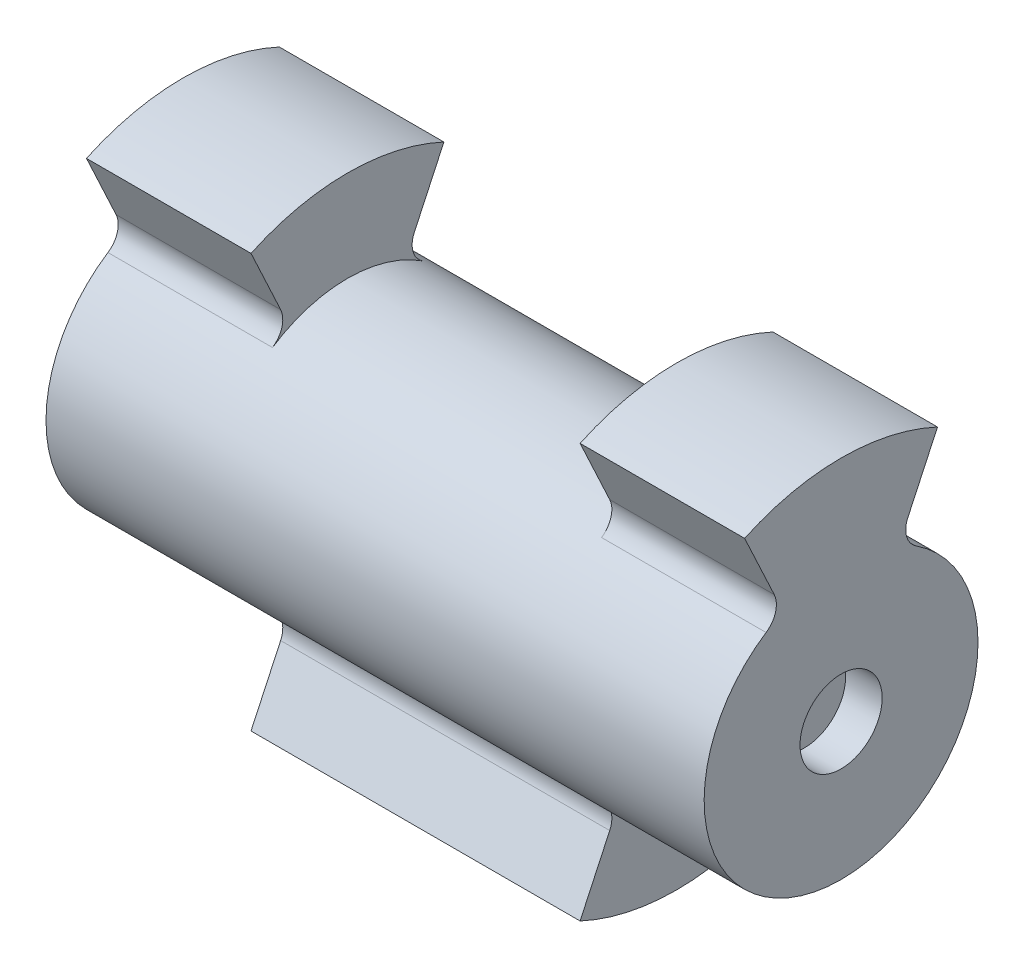
ISO-10303-21;
HEADER;
FILE_DESCRIPTION(('STEP AP214'),'2;1');
FILE_NAME('part.step','',(''),(''),'','','');
FILE_SCHEMA(('AUTOMOTIVE_DESIGN { 1 0 10303 214 1 1 1 1 }'));
ENDSEC;
DATA;
#1=APPLICATION_CONTEXT('core data for automotive mechanical design processes');
#2=APPLICATION_PROTOCOL_DEFINITION('international standard','automotive_design',2000,#1);
#3=PRODUCT_CONTEXT('',#1,'mechanical');
#4=PRODUCT('Part','Part','',(#3));
#5=PRODUCT_RELATED_PRODUCT_CATEGORY('part','',(#4));
#6=PRODUCT_DEFINITION_FORMATION('','',#4);
#7=PRODUCT_DEFINITION_CONTEXT('part definition',#1,'design');
#8=PRODUCT_DEFINITION('design','',#6,#7);
#9=PRODUCT_DEFINITION_SHAPE('','',#8);
#10=(LENGTH_UNIT() NAMED_UNIT(*) SI_UNIT(.MILLI.,.METRE.));
#11=(NAMED_UNIT(*) PLANE_ANGLE_UNIT() SI_UNIT($,.RADIAN.));
#12=(NAMED_UNIT(*) SI_UNIT($,.STERADIAN.) SOLID_ANGLE_UNIT());
#13=UNCERTAINTY_MEASURE_WITH_UNIT(LENGTH_MEASURE(1.E-05),#10,'distance_accuracy_value','');
#14=(GEOMETRIC_REPRESENTATION_CONTEXT(3) GLOBAL_UNCERTAINTY_ASSIGNED_CONTEXT((#13)) GLOBAL_UNIT_ASSIGNED_CONTEXT((#10,
#11,#12)) REPRESENTATION_CONTEXT('',''));
#15=CARTESIAN_POINT('',(0.,0.,0.));
#16=DIRECTION('',(0.,0.,1.));
#17=DIRECTION('',(1.,0.,0.));
#18=AXIS2_PLACEMENT_3D('',#15,#16,#17);
#19=CARTESIAN_POINT('',(-72.1,0.,0.));
#20=DIRECTION('',(1.,0.,0.));
#21=DIRECTION('',(0.,0.,-1.));
#22=AXIS2_PLACEMENT_3D('',#19,#20,#21);
#23=CYLINDRICAL_SURFACE('',#22,30.);
#24=CARTESIAN_POINT('',(-72.1,0.,0.));
#25=DIRECTION('',(1.,0.,0.));
#26=DIRECTION('',(0.,0.,-1.));
#27=AXIS2_PLACEMENT_3D('',#24,#25,#26);
#28=CIRCLE('',#27,30.);
#29=CARTESIAN_POINT('',(-72.1,25.0991411829877,16.43268425658));
#30=VERTEX_POINT('',#29);
#31=CARTESIAN_POINT('',(-72.1,25.0991411829877,-16.43268425658));
#32=VERTEX_POINT('',#31);
#33=EDGE_CURVE('E278',#30,#32,#28,.T.);
#34=ORIENTED_EDGE('',*,*,#33,.T.);
#35=DIRECTION('',(1.,0.,0.));
#36=VECTOR('',#35,1.);
#37=CARTESIAN_POINT('',(-72.1,25.0991411829877,-16.43268425658));
#38=LINE('',#37,#36);
#39=CARTESIAN_POINT('',(-36.05,25.0991411829877,-16.43268425658));
#40=VERTEX_POINT('',#39);
#41=EDGE_CURVE('E310',#32,#40,#38,.T.);
#42=ORIENTED_EDGE('',*,*,#41,.T.);
#43=CARTESIAN_POINT('',(-36.05,0.,0.));
#44=DIRECTION('',(1.,0.,0.));
#45=DIRECTION('',(0.,0.,-1.));
#46=AXIS2_PLACEMENT_3D('',#43,#44,#45);
#47=CIRCLE('',#46,30.);
#48=CARTESIAN_POINT('',(-36.05,25.0991411829877,16.43268425658));
#49=VERTEX_POINT('',#48);
#50=EDGE_CURVE('E240',#49,#40,#47,.F.);
#51=ORIENTED_EDGE('',*,*,#50,.F.);
#52=DIRECTION('',(1.,0.,0.));
#53=VECTOR('',#52,1.);
#54=CARTESIAN_POINT('',(-72.1,25.0991411829877,16.43268425658));
#55=LINE('',#54,#53);
#56=EDGE_CURVE('E306',#49,#30,#55,.F.);
#57=ORIENTED_EDGE('',*,*,#56,.T.);
#58=EDGE_LOOP('',(#34,#42,#51,#57));
#59=FACE_BOUND('',#58,.T.);
#60=CARTESIAN_POINT('',(36.05,0.,0.));
#61=DIRECTION('',(1.,0.,0.));
#62=DIRECTION('',(0.,0.,-1.));
#63=AXIS2_PLACEMENT_3D('',#60,#61,#62);
#64=CIRCLE('',#63,30.);
#65=CARTESIAN_POINT('',(36.05,25.0991411829877,16.43268425658));
#66=VERTEX_POINT('',#65);
#67=CARTESIAN_POINT('',(36.05,25.0991411829877,-16.43268425658));
#68=VERTEX_POINT('',#67);
#69=EDGE_CURVE('E282',#66,#68,#64,.F.);
#70=ORIENTED_EDGE('',*,*,#69,.T.);
#71=DIRECTION('',(1.,0.,0.));
#72=VECTOR('',#71,1.);
#73=CARTESIAN_POINT('',(-72.1,25.0991411829877,-16.43268425658));
#74=LINE('',#73,#72);
#75=CARTESIAN_POINT('',(72.1,25.0991411829877,-16.43268425658));
#76=VERTEX_POINT('',#75);
#77=EDGE_CURVE('E295',#68,#76,#74,.T.);
#78=ORIENTED_EDGE('',*,*,#77,.T.);
#79=CARTESIAN_POINT('',(72.1,0.,0.));
#80=DIRECTION('',(1.,0.,0.));
#81=DIRECTION('',(0.,0.,-1.));
#82=AXIS2_PLACEMENT_3D('',#79,#80,#81);
#83=CIRCLE('',#82,30.);
#84=CARTESIAN_POINT('',(72.1,25.0991411829877,16.43268425658));
#85=VERTEX_POINT('',#84);
#86=EDGE_CURVE('E271',#85,#76,#83,.T.);
#87=ORIENTED_EDGE('',*,*,#86,.F.);
#88=DIRECTION('',(1.,0.,0.));
#89=VECTOR('',#88,1.);
#90=CARTESIAN_POINT('',(-72.1,25.0991411829877,16.43268425658));
#91=LINE('',#90,#89);
#92=EDGE_CURVE('E291',#85,#66,#91,.F.);
#93=ORIENTED_EDGE('',*,*,#92,.T.);
#94=EDGE_LOOP('',(#70,#78,#87,#93));
#95=FACE_BOUND('',#94,.T.);
#96=CARTESIAN_POINT('',(-36.05,0.,0.));
#97=DIRECTION('',(1.,0.,0.));
#98=DIRECTION('',(0.,0.,-1.));
#99=AXIS2_PLACEMENT_3D('',#96,#97,#98);
#100=CIRCLE('',#99,30.);
#101=CARTESIAN_POINT('',(-36.05,-25.0991411829877,-16.43268425658));
#102=VERTEX_POINT('',#101);
#103=CARTESIAN_POINT('',(-36.05,-25.0991411829877,16.43268425658));
#104=VERTEX_POINT('',#103);
#105=EDGE_CURVE('E288',#102,#104,#100,.F.);
#106=ORIENTED_EDGE('',*,*,#105,.T.);
#107=DIRECTION('',(1.,0.,0.));
#108=VECTOR('',#107,1.);
#109=CARTESIAN_POINT('',(-72.1,-25.0991411829877,16.43268425658));
#110=LINE('',#109,#108);
#111=CARTESIAN_POINT('',(36.05,-25.0991411829877,16.43268425658));
#112=VERTEX_POINT('',#111);
#113=EDGE_CURVE('E302',#104,#112,#110,.T.);
#114=ORIENTED_EDGE('',*,*,#113,.T.);
#115=CARTESIAN_POINT('',(36.05,0.,0.));
#116=DIRECTION('',(1.,0.,0.));
#117=DIRECTION('',(0.,0.,-1.));
#118=AXIS2_PLACEMENT_3D('',#115,#116,#117);
#119=CIRCLE('',#118,30.);
#120=CARTESIAN_POINT('',(36.05,-25.0991411829877,-16.43268425658));
#121=VERTEX_POINT('',#120);
#122=EDGE_CURVE('E285',#121,#112,#119,.F.);
#123=ORIENTED_EDGE('',*,*,#122,.F.);
#124=DIRECTION('',(1.,0.,0.));
#125=VECTOR('',#124,1.);
#126=CARTESIAN_POINT('',(-72.1,-25.0991411829877,-16.43268425658));
#127=LINE('',#126,#125);
#128=EDGE_CURVE('E298',#121,#102,#127,.F.);
#129=ORIENTED_EDGE('',*,*,#128,.T.);
#130=EDGE_LOOP('',(#106,#114,#123,#129));
#131=FACE_BOUND('',#130,.T.);
#132=ADVANCED_FACE('F41',(#59,#95,#131),#23,.T.);
#133=CARTESIAN_POINT('',(-72.1,0.,0.));
#134=DIRECTION('',(1.,0.,0.));
#135=DIRECTION('',(0.,0.,-1.));
#136=AXIS2_PLACEMENT_3D('',#133,#134,#135);
#137=PLANE('',#136);
#138=CARTESIAN_POINT('',(-72.1,0.,0.));
#139=DIRECTION('',(1.,0.,0.));
#140=DIRECTION('',(0.,0.,-1.));
#141=AXIS2_PLACEMENT_3D('',#138,#139,#140);
#142=CIRCLE('',#141,9.);
#143=CARTESIAN_POINT('',(-72.1,0.,-9.));
#144=VERTEX_POINT('',#143);
#145=EDGE_CURVE('E481',#144,#144,#142,.T.);
#146=ORIENTED_EDGE('',*,*,#145,.T.);
#147=EDGE_LOOP('',(#146));
#148=FACE_BOUND('',#147,.T.);
#149=ORIENTED_EDGE('',*,*,#33,.F.);
#150=CARTESIAN_POINT('',(-72.1,29.2823313801523,19.1714649660099));
#151=DIRECTION('',(1.,0.,0.));
#152=DIRECTION('',(0.,0.,-1.));
#153=AXIS2_PLACEMENT_3D('',#150,#151,#152);
#154=CIRCLE('',#153,5.);
#155=CARTESIAN_POINT('',(-72.1,31.3954226888558,14.6399260308267));
#156=VERTEX_POINT('',#155);
#157=EDGE_CURVE('E339',#30,#156,#154,.T.);
#158=ORIENTED_EDGE('',*,*,#157,.T.);
#159=DIRECTION('',(0.,-0.90630778703665,-0.4226182617407));
#160=VECTOR('',#159,1.);
#161=CARTESIAN_POINT('',(-72.1,16.3135401666597,7.60712871133261));
#162=LINE('',#161,#160);
#163=CARTESIAN_POINT('',(-72.1,45.3153893518325,21.130913087035));
#164=VERTEX_POINT('',#163);
#165=EDGE_CURVE('E220',#164,#156,#162,.T.);
#166=ORIENTED_EDGE('',*,*,#165,.F.);
#167=CARTESIAN_POINT('',(-72.1,0.,0.));
#168=DIRECTION('',(1.,0.,0.));
#169=DIRECTION('',(0.,0.,-1.));
#170=AXIS2_PLACEMENT_3D('',#167,#168,#169);
#171=CIRCLE('',#170,50.);
#172=CARTESIAN_POINT('',(-72.1,45.3153893518325,-21.130913087035));
#173=VERTEX_POINT('',#172);
#174=EDGE_CURVE('E230',#173,#164,#171,.T.);
#175=ORIENTED_EDGE('',*,*,#174,.F.);
#176=DIRECTION('',(0.,0.90630778703665,-0.4226182617407));
#177=VECTOR('',#176,1.);
#178=CARTESIAN_POINT('',(-72.1,16.3135401666597,-7.60712871133261));
#179=LINE('',#178,#177);
#180=CARTESIAN_POINT('',(-72.1,31.3954226888558,-14.6399260308267));
#181=VERTEX_POINT('',#180);
#182=EDGE_CURVE('E214',#181,#173,#179,.T.);
#183=ORIENTED_EDGE('',*,*,#182,.F.);
#184=CARTESIAN_POINT('',(-72.1,29.2823313801523,-19.1714649660099));
#185=DIRECTION('',(1.,0.,0.));
#186=DIRECTION('',(0.,0.,-1.));
#187=AXIS2_PLACEMENT_3D('',#184,#185,#186);
#188=CIRCLE('',#187,5.);
#189=EDGE_CURVE('E336',#181,#32,#188,.T.);
#190=ORIENTED_EDGE('',*,*,#189,.T.);
#191=EDGE_LOOP('',(#149,#158,#166,#175,#183,#190));
#192=FACE_BOUND('',#191,.T.);
#193=ADVANCED_FACE('F399',(#148,#192),#137,.F.);
#194=CARTESIAN_POINT('',(72.1,0.,0.));
#195=DIRECTION('',(1.,0.,0.));
#196=DIRECTION('',(0.,0.,-1.));
#197=AXIS2_PLACEMENT_3D('',#194,#195,#196);
#198=PLANE('',#197);
#199=CARTESIAN_POINT('',(72.1,0.,0.));
#200=DIRECTION('',(1.,0.,0.));
#201=DIRECTION('',(0.,0.,-1.));
#202=AXIS2_PLACEMENT_3D('',#199,#200,#201);
#203=CIRCLE('',#202,9.);
#204=CARTESIAN_POINT('',(72.1,0.,-9.));
#205=VERTEX_POINT('',#204);
#206=EDGE_CURVE('E200',#205,#205,#203,.T.);
#207=ORIENTED_EDGE('',*,*,#206,.F.);
#208=EDGE_LOOP('',(#207));
#209=FACE_BOUND('',#208,.T.);
#210=DIRECTION('',(0.,-0.90630778703665,-0.4226182617407));
#211=VECTOR('',#210,1.);
#212=CARTESIAN_POINT('',(72.1,16.3135401666597,7.60712871133261));
#213=LINE('',#212,#211);
#214=CARTESIAN_POINT('',(72.1,45.3153893518325,21.130913087035));
#215=VERTEX_POINT('',#214);
#216=CARTESIAN_POINT('',(72.1,31.3954226888558,14.6399260308267));
#217=VERTEX_POINT('',#216);
#218=EDGE_CURVE('E251',#215,#217,#213,.T.);
#219=ORIENTED_EDGE('',*,*,#218,.T.);
#220=CARTESIAN_POINT('',(72.1,29.2823313801523,19.1714649660099));
#221=DIRECTION('',(1.,0.,0.));
#222=DIRECTION('',(0.,0.,-1.));
#223=AXIS2_PLACEMENT_3D('',#220,#221,#222);
#224=CIRCLE('',#223,5.);
#225=EDGE_CURVE('E50',#217,#85,#224,.F.);
#226=ORIENTED_EDGE('',*,*,#225,.T.);
#227=ORIENTED_EDGE('',*,*,#86,.T.);
#228=CARTESIAN_POINT('',(72.1,29.2823313801523,-19.1714649660099));
#229=DIRECTION('',(1.,0.,0.));
#230=DIRECTION('',(0.,0.,-1.));
#231=AXIS2_PLACEMENT_3D('',#228,#229,#230);
#232=CIRCLE('',#231,5.);
#233=CARTESIAN_POINT('',(72.1,31.3954226888558,-14.6399260308267));
#234=VERTEX_POINT('',#233);
#235=EDGE_CURVE('E363',#76,#234,#232,.F.);
#236=ORIENTED_EDGE('',*,*,#235,.T.);
#237=DIRECTION('',(0.,0.90630778703665,-0.4226182617407));
#238=VECTOR('',#237,1.);
#239=CARTESIAN_POINT('',(72.1,16.3135401666597,-7.60712871133261));
#240=LINE('',#239,#238);
#241=CARTESIAN_POINT('',(72.1,45.3153893518325,-21.130913087035));
#242=VERTEX_POINT('',#241);
#243=EDGE_CURVE('E246',#234,#242,#240,.T.);
#244=ORIENTED_EDGE('',*,*,#243,.T.);
#245=CARTESIAN_POINT('',(72.1,0.,0.));
#246=DIRECTION('',(1.,0.,0.));
#247=DIRECTION('',(0.,0.,-1.));
#248=AXIS2_PLACEMENT_3D('',#245,#246,#247);
#249=CIRCLE('',#248,50.);
#250=EDGE_CURVE('E261',#242,#215,#249,.T.);
#251=ORIENTED_EDGE('',*,*,#250,.T.);
#252=EDGE_LOOP('',(#219,#226,#227,#236,#244,#251));
#253=FACE_BOUND('',#252,.T.);
#254=ADVANCED_FACE('F368',(#209,#253),#198,.T.);
#255=CARTESIAN_POINT('',(36.05,16.3135401666597,7.60712871133261));
#256=DIRECTION('',(0.,-0.4226182617407,0.90630778703665));
#257=DIRECTION('',(0.,-0.90630778703665,-0.4226182617407));
#258=AXIS2_PLACEMENT_3D('',#255,#256,#257);
#259=PLANE('',#258);
#260=DIRECTION('',(0.,-0.90630778703665,-0.4226182617407));
#261=VECTOR('',#260,1.);
#262=CARTESIAN_POINT('',(36.05,16.3135401666597,7.60712871133261));
#263=LINE('',#262,#261);
#264=CARTESIAN_POINT('',(36.05,45.3153893518325,21.130913087035));
#265=VERTEX_POINT('',#264);
#266=CARTESIAN_POINT('',(36.05,31.3954226888558,14.6399260308267));
#267=VERTEX_POINT('',#266);
#268=EDGE_CURVE('E255',#265,#267,#263,.T.);
#269=ORIENTED_EDGE('',*,*,#268,.T.);
#270=DIRECTION('',(-1.,0.,0.));
#271=VECTOR('',#270,1.);
#272=CARTESIAN_POINT('',(72.1,31.3954226888558,14.6399260308267));
#273=LINE('',#272,#271);
#274=EDGE_CURVE('E330',#267,#217,#273,.F.);
#275=ORIENTED_EDGE('',*,*,#274,.T.);
#276=ORIENTED_EDGE('',*,*,#218,.F.);
#277=DIRECTION('',(1.,0.,0.));
#278=VECTOR('',#277,1.);
#279=CARTESIAN_POINT('',(36.05,45.3153893518325,21.130913087035));
#280=LINE('',#279,#278);
#281=EDGE_CURVE('E268',#265,#215,#280,.T.);
#282=ORIENTED_EDGE('',*,*,#281,.F.);
#283=EDGE_LOOP('',(#269,#275,#276,#282));
#284=FACE_BOUND('',#283,.T.);
#285=ADVANCED_FACE('F375',(#284),#259,.T.);
#286=CARTESIAN_POINT('',(36.05,0.,0.));
#287=DIRECTION('',(1.,0.,0.));
#288=DIRECTION('',(0.,0.,-1.));
#289=AXIS2_PLACEMENT_3D('',#286,#287,#288);
#290=CYLINDRICAL_SURFACE('',#289,50.);
#291=ORIENTED_EDGE('',*,*,#250,.F.);
#292=DIRECTION('',(1.,0.,0.));
#293=VECTOR('',#292,1.);
#294=CARTESIAN_POINT('',(36.05,45.3153893518325,-21.130913087035));
#295=LINE('',#294,#293);
#296=CARTESIAN_POINT('',(36.05,45.3153893518325,-21.130913087035));
#297=VERTEX_POINT('',#296);
#298=EDGE_CURVE('E258',#297,#242,#295,.T.);
#299=ORIENTED_EDGE('',*,*,#298,.F.);
#300=CARTESIAN_POINT('',(36.05,0.,0.));
#301=DIRECTION('',(1.,0.,0.));
#302=DIRECTION('',(0.,0.,-1.));
#303=AXIS2_PLACEMENT_3D('',#300,#301,#302);
#304=CIRCLE('',#303,50.);
#305=EDGE_CURVE('E250',#297,#265,#304,.T.);
#306=ORIENTED_EDGE('',*,*,#305,.T.);
#307=ORIENTED_EDGE('',*,*,#281,.T.);
#308=EDGE_LOOP('',(#291,#299,#306,#307));
#309=FACE_BOUND('',#308,.T.);
#310=ADVANCED_FACE('F382',(#309),#290,.T.);
#311=CARTESIAN_POINT('',(36.05,16.3135401666597,-7.60712871133261));
#312=DIRECTION('',(0.,-0.4226182617407,-0.90630778703665));
#313=DIRECTION('',(0.,0.90630778703665,-0.4226182617407));
#314=AXIS2_PLACEMENT_3D('',#311,#312,#313);
#315=PLANE('',#314);
#316=ORIENTED_EDGE('',*,*,#243,.F.);
#317=DIRECTION('',(-1.,0.,0.));
#318=VECTOR('',#317,1.);
#319=CARTESIAN_POINT('',(36.05,31.3954226888558,-14.6399260308267));
#320=LINE('',#319,#318);
#321=CARTESIAN_POINT('',(36.05,31.3954226888558,-14.6399260308267));
#322=VERTEX_POINT('',#321);
#323=EDGE_CURVE('E326',#234,#322,#320,.T.);
#324=ORIENTED_EDGE('',*,*,#323,.T.);
#325=DIRECTION('',(0.,0.90630778703665,-0.4226182617407));
#326=VECTOR('',#325,1.);
#327=CARTESIAN_POINT('',(36.05,16.3135401666597,-7.60712871133261));
#328=LINE('',#327,#326);
#329=EDGE_CURVE('E247',#322,#297,#328,.T.);
#330=ORIENTED_EDGE('',*,*,#329,.T.);
#331=ORIENTED_EDGE('',*,*,#298,.T.);
#332=EDGE_LOOP('',(#316,#324,#330,#331));
#333=FACE_BOUND('',#332,.T.);
#334=ADVANCED_FACE('F385',(#333),#315,.T.);
#335=CARTESIAN_POINT('',(36.05,0.,0.));
#336=DIRECTION('',(1.,0.,0.));
#337=DIRECTION('',(0.,0.,-1.));
#338=AXIS2_PLACEMENT_3D('',#335,#336,#337);
#339=PLANE('',#338);
#340=ORIENTED_EDGE('',*,*,#69,.F.);
#341=CARTESIAN_POINT('',(36.05,29.2823313801523,19.1714649660099));
#342=DIRECTION('',(1.,0.,0.));
#343=DIRECTION('',(0.,0.,-1.));
#344=AXIS2_PLACEMENT_3D('',#341,#342,#343);
#345=CIRCLE('',#344,5.);
#346=EDGE_CURVE('E11',#66,#267,#345,.T.);
#347=ORIENTED_EDGE('',*,*,#346,.T.);
#348=ORIENTED_EDGE('',*,*,#268,.F.);
#349=ORIENTED_EDGE('',*,*,#305,.F.);
#350=ORIENTED_EDGE('',*,*,#329,.F.);
#351=CARTESIAN_POINT('',(36.05,29.2823313801523,-19.1714649660099));
#352=DIRECTION('',(1.,0.,0.));
#353=DIRECTION('',(0.,0.,-1.));
#354=AXIS2_PLACEMENT_3D('',#351,#352,#353);
#355=CIRCLE('',#354,5.);
#356=EDGE_CURVE('E359',#322,#68,#355,.T.);
#357=ORIENTED_EDGE('',*,*,#356,.T.);
#358=EDGE_LOOP('',(#340,#347,#348,#349,#350,#357));
#359=FACE_BOUND('',#358,.T.);
#360=ADVANCED_FACE('F377',(#359),#339,.F.);
#361=CARTESIAN_POINT('',(-36.05,16.3135401666597,7.60712871133261));
#362=DIRECTION('',(0.,-0.4226182617407,0.90630778703665));
#363=DIRECTION('',(0.,-0.90630778703665,-0.4226182617407));
#364=AXIS2_PLACEMENT_3D('',#361,#362,#363);
#365=PLANE('',#364);
#366=ORIENTED_EDGE('',*,*,#165,.T.);
#367=DIRECTION('',(-1.,0.,0.));
#368=VECTOR('',#367,1.);
#369=CARTESIAN_POINT('',(-36.05,31.3954226888558,14.6399260308267));
#370=LINE('',#369,#368);
#371=CARTESIAN_POINT('',(-36.05,31.3954226888558,14.6399260308267));
#372=VERTEX_POINT('',#371);
#373=EDGE_CURVE('E317',#156,#372,#370,.F.);
#374=ORIENTED_EDGE('',*,*,#373,.T.);
#375=DIRECTION('',(0.,-0.90630778703665,-0.4226182617407));
#376=VECTOR('',#375,1.);
#377=CARTESIAN_POINT('',(-36.05,16.3135401666597,7.60712871133261));
#378=LINE('',#377,#376);
#379=CARTESIAN_POINT('',(-36.05,45.3153893518325,21.130913087035));
#380=VERTEX_POINT('',#379);
#381=EDGE_CURVE('E223',#380,#372,#378,.T.);
#382=ORIENTED_EDGE('',*,*,#381,.F.);
#383=DIRECTION('',(-1.,0.,0.));
#384=VECTOR('',#383,1.);
#385=CARTESIAN_POINT('',(-36.05,45.3153893518325,21.130913087035));
#386=LINE('',#385,#384);
#387=EDGE_CURVE('E237',#380,#164,#386,.T.);
#388=ORIENTED_EDGE('',*,*,#387,.T.);
#389=EDGE_LOOP('',(#366,#374,#382,#388));
#390=FACE_BOUND('',#389,.T.);
#391=ADVANCED_FACE('F452',(#390),#365,.T.);
#392=CARTESIAN_POINT('',(-36.05,0.,0.));
#393=DIRECTION('',(-1.,0.,0.));
#394=DIRECTION('',(0.,0.,-1.));
#395=AXIS2_PLACEMENT_3D('',#392,#393,#394);
#396=CYLINDRICAL_SURFACE('',#395,50.);
#397=ORIENTED_EDGE('',*,*,#174,.T.);
#398=ORIENTED_EDGE('',*,*,#387,.F.);
#399=CARTESIAN_POINT('',(-36.05,0.,0.));
#400=DIRECTION('',(1.,0.,0.));
#401=DIRECTION('',(0.,0.,-1.));
#402=AXIS2_PLACEMENT_3D('',#399,#400,#401);
#403=CIRCLE('',#402,50.);
#404=CARTESIAN_POINT('',(-36.05,45.3153893518325,-21.130913087035));
#405=VERTEX_POINT('',#404);
#406=EDGE_CURVE('E219',#405,#380,#403,.T.);
#407=ORIENTED_EDGE('',*,*,#406,.F.);
#408=DIRECTION('',(-1.,0.,0.));
#409=VECTOR('',#408,1.);
#410=CARTESIAN_POINT('',(-36.05,45.3153893518325,-21.130913087035));
#411=LINE('',#410,#409);
#412=EDGE_CURVE('E227',#405,#173,#411,.T.);
#413=ORIENTED_EDGE('',*,*,#412,.T.);
#414=EDGE_LOOP('',(#397,#398,#407,#413));
#415=FACE_BOUND('',#414,.T.);
#416=ADVANCED_FACE('F455',(#415),#396,.T.);
#417=CARTESIAN_POINT('',(-36.05,16.3135401666597,-7.60712871133261));
#418=DIRECTION('',(0.,-0.4226182617407,-0.90630778703665));
#419=DIRECTION('',(0.,0.90630778703665,-0.4226182617407));
#420=AXIS2_PLACEMENT_3D('',#417,#418,#419);
#421=PLANE('',#420);
#422=DIRECTION('',(0.,0.90630778703665,-0.4226182617407));
#423=VECTOR('',#422,1.);
#424=CARTESIAN_POINT('',(-36.05,16.3135401666597,-7.60712871133261));
#425=LINE('',#424,#423);
#426=CARTESIAN_POINT('',(-36.05,31.3954226888558,-14.6399260308267));
#427=VERTEX_POINT('',#426);
#428=EDGE_CURVE('E216',#427,#405,#425,.T.);
#429=ORIENTED_EDGE('',*,*,#428,.F.);
#430=DIRECTION('',(-1.,0.,0.));
#431=VECTOR('',#430,1.);
#432=CARTESIAN_POINT('',(-72.1,31.3954226888558,-14.6399260308267));
#433=LINE('',#432,#431);
#434=EDGE_CURVE('E314',#427,#181,#433,.T.);
#435=ORIENTED_EDGE('',*,*,#434,.T.);
#436=ORIENTED_EDGE('',*,*,#182,.T.);
#437=ORIENTED_EDGE('',*,*,#412,.F.);
#438=EDGE_LOOP('',(#429,#435,#436,#437));
#439=FACE_BOUND('',#438,.T.);
#440=ADVANCED_FACE('F450',(#439),#421,.T.);
#441=CARTESIAN_POINT('',(-36.05,0.,0.));
#442=DIRECTION('',(-1.,0.,0.));
#443=DIRECTION('',(0.,0.,-1.));
#444=AXIS2_PLACEMENT_3D('',#441,#442,#443);
#445=PLANE('',#444);
#446=ORIENTED_EDGE('',*,*,#50,.T.);
#447=CARTESIAN_POINT('',(-36.05,29.2823313801523,-19.1714649660099));
#448=DIRECTION('',(-1.,0.,0.));
#449=DIRECTION('',(0.,0.,1.));
#450=AXIS2_PLACEMENT_3D('',#447,#448,#449);
#451=CIRCLE('',#450,5.);
#452=EDGE_CURVE('E333',#40,#427,#451,.T.);
#453=ORIENTED_EDGE('',*,*,#452,.T.);
#454=ORIENTED_EDGE('',*,*,#428,.T.);
#455=ORIENTED_EDGE('',*,*,#406,.T.);
#456=ORIENTED_EDGE('',*,*,#381,.T.);
#457=CARTESIAN_POINT('',(-36.05,29.2823313801523,19.1714649660099));
#458=DIRECTION('',(-1.,0.,0.));
#459=DIRECTION('',(0.,0.,1.));
#460=AXIS2_PLACEMENT_3D('',#457,#458,#459);
#461=CIRCLE('',#460,5.);
#462=EDGE_CURVE('E342',#372,#49,#461,.T.);
#463=ORIENTED_EDGE('',*,*,#462,.T.);
#464=EDGE_LOOP('',(#446,#453,#454,#455,#456,#463));
#465=FACE_BOUND('',#464,.T.);
#466=ADVANCED_FACE('F447',(#465),#445,.F.);
#467=CARTESIAN_POINT('',(-36.05,0.,0.));
#468=DIRECTION('',(1.,0.,0.));
#469=DIRECTION('',(0.,0.,-1.));
#470=AXIS2_PLACEMENT_3D('',#467,#468,#469);
#471=CYLINDRICAL_SURFACE('',#470,50.);
#472=DIRECTION('',(1.,0.,0.));
#473=VECTOR('',#472,1.);
#474=CARTESIAN_POINT('',(-36.05,-45.3153893518325,-21.130913087035));
#475=LINE('',#474,#473);
#476=CARTESIAN_POINT('',(-36.05,-45.3153893518325,-21.130913087035));
#477=VERTEX_POINT('',#476);
#478=CARTESIAN_POINT('',(36.05,-45.3153893518325,-21.130913087035));
#479=VERTEX_POINT('',#478);
#480=EDGE_CURVE('E166',#477,#479,#475,.T.);
#481=ORIENTED_EDGE('',*,*,#480,.T.);
#482=CARTESIAN_POINT('',(36.05,0.,0.));
#483=DIRECTION('',(1.,0.,0.));
#484=DIRECTION('',(0.,0.,-1.));
#485=AXIS2_PLACEMENT_3D('',#482,#483,#484);
#486=CIRCLE('',#485,50.);
#487=CARTESIAN_POINT('',(36.05,-45.3153893518325,21.130913087035));
#488=VERTEX_POINT('',#487);
#489=EDGE_CURVE('E171',#488,#479,#486,.T.);
#490=ORIENTED_EDGE('',*,*,#489,.F.);
#491=DIRECTION('',(1.,0.,0.));
#492=VECTOR('',#491,1.);
#493=CARTESIAN_POINT('',(-36.05,-45.3153893518325,21.130913087035));
#494=LINE('',#493,#492);
#495=CARTESIAN_POINT('',(-36.05,-45.3153893518325,21.130913087035));
#496=VERTEX_POINT('',#495);
#497=EDGE_CURVE('E178',#496,#488,#494,.T.);
#498=ORIENTED_EDGE('',*,*,#497,.F.);
#499=CARTESIAN_POINT('',(-36.05,0.,0.));
#500=DIRECTION('',(1.,0.,0.));
#501=DIRECTION('',(0.,0.,-1.));
#502=AXIS2_PLACEMENT_3D('',#499,#500,#501);
#503=CIRCLE('',#502,50.);
#504=EDGE_CURVE('E173',#496,#477,#503,.T.);
#505=ORIENTED_EDGE('',*,*,#504,.T.);
#506=EDGE_LOOP('',(#481,#490,#498,#505));
#507=FACE_BOUND('',#506,.T.);
#508=ADVANCED_FACE('F168',(#507),#471,.T.);
#509=CARTESIAN_POINT('',(-36.05,-16.3135401666597,7.6071287113326));
#510=DIRECTION('',(0.,0.4226182617407,0.90630778703665));
#511=DIRECTION('',(0.,-0.90630778703665,0.4226182617407));
#512=AXIS2_PLACEMENT_3D('',#509,#510,#511);
#513=PLANE('',#512);
#514=DIRECTION('',(0.,-0.90630778703665,0.4226182617407));
#515=VECTOR('',#514,1.);
#516=CARTESIAN_POINT('',(36.05,-16.3135401666597,7.6071287113326));
#517=LINE('',#516,#515);
#518=CARTESIAN_POINT('',(36.05,-31.3954226888558,14.6399260308267));
#519=VERTEX_POINT('',#518);
#520=EDGE_CURVE('E190',#519,#488,#517,.T.);
#521=ORIENTED_EDGE('',*,*,#520,.F.);
#522=DIRECTION('',(-1.,0.,0.));
#523=VECTOR('',#522,1.);
#524=CARTESIAN_POINT('',(-36.05,-31.3954226888558,14.6399260308267));
#525=LINE('',#524,#523);
#526=CARTESIAN_POINT('',(-36.05,-31.3954226888558,14.6399260308267));
#527=VERTEX_POINT('',#526);
#528=EDGE_CURVE('E320',#519,#527,#525,.T.);
#529=ORIENTED_EDGE('',*,*,#528,.T.);
#530=DIRECTION('',(0.,-0.90630778703665,0.4226182617407));
#531=VECTOR('',#530,1.);
#532=CARTESIAN_POINT('',(-36.05,-16.3135401666597,7.6071287113326));
#533=LINE('',#532,#531);
#534=EDGE_CURVE('E179',#527,#496,#533,.T.);
#535=ORIENTED_EDGE('',*,*,#534,.T.);
#536=ORIENTED_EDGE('',*,*,#497,.T.);
#537=EDGE_LOOP('',(#521,#529,#535,#536));
#538=FACE_BOUND('',#537,.T.);
#539=ADVANCED_FACE('F426',(#538),#513,.T.);
#540=CARTESIAN_POINT('',(-36.05,-16.3135401666597,-7.6071287113326));
#541=DIRECTION('',(0.,0.4226182617407,-0.90630778703665));
#542=DIRECTION('',(0.,0.90630778703665,0.4226182617407));
#543=AXIS2_PLACEMENT_3D('',#540,#541,#542);
#544=PLANE('',#543);
#545=DIRECTION('',(0.,0.90630778703665,0.4226182617407));
#546=VECTOR('',#545,1.);
#547=CARTESIAN_POINT('',(-36.05,-16.3135401666597,-7.6071287113326));
#548=LINE('',#547,#546);
#549=CARTESIAN_POINT('',(-36.05,-31.3954226888558,-14.6399260308267));
#550=VERTEX_POINT('',#549);
#551=EDGE_CURVE('E208',#477,#550,#548,.T.);
#552=ORIENTED_EDGE('',*,*,#551,.T.);
#553=DIRECTION('',(-1.,0.,0.));
#554=VECTOR('',#553,1.);
#555=CARTESIAN_POINT('',(36.05,-31.3954226888558,-14.6399260308267));
#556=LINE('',#555,#554);
#557=CARTESIAN_POINT('',(36.05,-31.3954226888558,-14.6399260308267));
#558=VERTEX_POINT('',#557);
#559=EDGE_CURVE('E186',#550,#558,#556,.F.);
#560=ORIENTED_EDGE('',*,*,#559,.T.);
#561=DIRECTION('',(0.,0.90630778703665,0.4226182617407));
#562=VECTOR('',#561,1.);
#563=CARTESIAN_POINT('',(36.05,-16.3135401666597,-7.6071287113326));
#564=LINE('',#563,#562);
#565=EDGE_CURVE('E183',#479,#558,#564,.T.);
#566=ORIENTED_EDGE('',*,*,#565,.F.);
#567=ORIENTED_EDGE('',*,*,#480,.F.);
#568=EDGE_LOOP('',(#552,#560,#566,#567));
#569=FACE_BOUND('',#568,.T.);
#570=ADVANCED_FACE('F184',(#569),#544,.T.);
#571=CARTESIAN_POINT('',(-36.05,0.,0.));
#572=DIRECTION('',(1.,0.,0.));
#573=DIRECTION('',(0.,0.,-1.));
#574=AXIS2_PLACEMENT_3D('',#571,#572,#573);
#575=PLANE('',#574);
#576=ORIENTED_EDGE('',*,*,#105,.F.);
#577=CARTESIAN_POINT('',(-36.05,-29.2823313801523,-19.1714649660099));
#578=DIRECTION('',(1.,0.,0.));
#579=DIRECTION('',(0.,0.,-1.));
#580=AXIS2_PLACEMENT_3D('',#577,#578,#579);
#581=CIRCLE('',#580,5.);
#582=EDGE_CURVE('E356',#102,#550,#581,.T.);
#583=ORIENTED_EDGE('',*,*,#582,.T.);
#584=ORIENTED_EDGE('',*,*,#551,.F.);
#585=ORIENTED_EDGE('',*,*,#504,.F.);
#586=ORIENTED_EDGE('',*,*,#534,.F.);
#587=CARTESIAN_POINT('',(-36.05,-29.2823313801523,19.1714649660099));
#588=DIRECTION('',(1.,0.,0.));
#589=DIRECTION('',(0.,0.,-1.));
#590=AXIS2_PLACEMENT_3D('',#587,#588,#589);
#591=CIRCLE('',#590,5.);
#592=EDGE_CURVE('E346',#527,#104,#591,.T.);
#593=ORIENTED_EDGE('',*,*,#592,.T.);
#594=EDGE_LOOP('',(#576,#583,#584,#585,#586,#593));
#595=FACE_BOUND('',#594,.T.);
#596=ADVANCED_FACE('F429',(#595),#575,.F.);
#597=CARTESIAN_POINT('',(36.05,0.,0.));
#598=DIRECTION('',(1.,0.,0.));
#599=DIRECTION('',(0.,0.,-1.));
#600=AXIS2_PLACEMENT_3D('',#597,#598,#599);
#601=PLANE('',#600);
#602=ORIENTED_EDGE('',*,*,#565,.T.);
#603=CARTESIAN_POINT('',(36.05,-29.2823313801523,-19.1714649660099));
#604=DIRECTION('',(1.,0.,0.));
#605=DIRECTION('',(0.,0.,-1.));
#606=AXIS2_PLACEMENT_3D('',#603,#604,#605);
#607=CIRCLE('',#606,5.);
#608=EDGE_CURVE('E353',#558,#121,#607,.F.);
#609=ORIENTED_EDGE('',*,*,#608,.T.);
#610=ORIENTED_EDGE('',*,*,#122,.T.);
#611=CARTESIAN_POINT('',(36.05,-29.2823313801523,19.1714649660099));
#612=DIRECTION('',(1.,0.,0.));
#613=DIRECTION('',(0.,0.,-1.));
#614=AXIS2_PLACEMENT_3D('',#611,#612,#613);
#615=CIRCLE('',#614,5.);
#616=EDGE_CURVE('E350',#112,#519,#615,.F.);
#617=ORIENTED_EDGE('',*,*,#616,.T.);
#618=ORIENTED_EDGE('',*,*,#520,.T.);
#619=ORIENTED_EDGE('',*,*,#489,.T.);
#620=EDGE_LOOP('',(#602,#609,#610,#617,#618,#619));
#621=FACE_BOUND('',#620,.T.);
#622=ADVANCED_FACE('F192',(#621),#601,.T.);
#623=CARTESIAN_POINT('',(64.1,0.,0.));
#624=DIRECTION('',(1.,0.,0.));
#625=DIRECTION('',(0.,0.,-1.));
#626=AXIS2_PLACEMENT_3D('',#623,#624,#625);
#627=CYLINDRICAL_SURFACE('',#626,9.);
#628=CARTESIAN_POINT('',(64.1,0.,0.));
#629=DIRECTION('',(1.,0.,0.));
#630=DIRECTION('',(0.,0.,-1.));
#631=AXIS2_PLACEMENT_3D('',#628,#629,#630);
#632=CIRCLE('',#631,9.);
#633=CARTESIAN_POINT('',(64.1,0.,-9.));
#634=VERTEX_POINT('',#633);
#635=EDGE_CURVE('E196',#634,#634,#632,.T.);
#636=ORIENTED_EDGE('',*,*,#635,.F.);
#637=EDGE_LOOP('',(#636));
#638=FACE_BOUND('',#637,.T.);
#639=ORIENTED_EDGE('',*,*,#206,.T.);
#640=EDGE_LOOP('',(#639));
#641=FACE_BOUND('',#640,.T.);
#642=ADVANCED_FACE('F438',(#638,#641),#627,.F.);
#643=CARTESIAN_POINT('',(64.1,0.,0.));
#644=DIRECTION('',(1.,0.,0.));
#645=DIRECTION('',(0.,0.,-1.));
#646=AXIS2_PLACEMENT_3D('',#643,#644,#645);
#647=PLANE('',#646);
#648=ORIENTED_EDGE('',*,*,#635,.T.);
#649=EDGE_LOOP('',(#648));
#650=FACE_BOUND('',#649,.T.);
#651=ADVANCED_FACE('F493',(#650),#647,.T.);
#652=CARTESIAN_POINT('',(-64.1,0.,0.));
#653=DIRECTION('',(-1.,0.,0.));
#654=DIRECTION('',(0.,0.,1.));
#655=AXIS2_PLACEMENT_3D('',#652,#653,#654);
#656=CYLINDRICAL_SURFACE('',#655,9.);
#657=CARTESIAN_POINT('',(-64.1,0.,0.));
#658=DIRECTION('',(1.,0.,0.));
#659=DIRECTION('',(0.,0.,-1.));
#660=AXIS2_PLACEMENT_3D('',#657,#658,#659);
#661=CIRCLE('',#660,9.);
#662=CARTESIAN_POINT('',(-64.1,0.,-9.));
#663=VERTEX_POINT('',#662);
#664=EDGE_CURVE('E478',#663,#663,#661,.T.);
#665=ORIENTED_EDGE('',*,*,#664,.T.);
#666=EDGE_LOOP('',(#665));
#667=FACE_BOUND('',#666,.T.);
#668=ORIENTED_EDGE('',*,*,#145,.F.);
#669=EDGE_LOOP('',(#668));
#670=FACE_BOUND('',#669,.T.);
#671=ADVANCED_FACE('F491',(#667,#670),#656,.F.);
#672=CARTESIAN_POINT('',(-64.1,0.,0.));
#673=DIRECTION('',(-1.,0.,0.));
#674=DIRECTION('',(0.,0.,-1.));
#675=AXIS2_PLACEMENT_3D('',#672,#673,#674);
#676=PLANE('',#675);
#677=ORIENTED_EDGE('',*,*,#664,.F.);
#678=EDGE_LOOP('',(#677));
#679=FACE_BOUND('',#678,.T.);
#680=ADVANCED_FACE('F413',(#679),#676,.T.);
#681=CARTESIAN_POINT('',(-72.1,29.2823313801523,-19.1714649660099));
#682=DIRECTION('',(1.,0.,0.));
#683=DIRECTION('',(0.,0.,-1.));
#684=AXIS2_PLACEMENT_3D('',#681,#682,#683);
#685=CYLINDRICAL_SURFACE('',#684,5.);
#686=ORIENTED_EDGE('',*,*,#189,.F.);
#687=ORIENTED_EDGE('',*,*,#434,.F.);
#688=ORIENTED_EDGE('',*,*,#452,.F.);
#689=ORIENTED_EDGE('',*,*,#41,.F.);
#690=EDGE_LOOP('',(#686,#687,#688,#689));
#691=FACE_BOUND('',#690,.T.);
#692=ADVANCED_FACE('F409',(#691),#685,.F.);
#693=CARTESIAN_POINT('',(-72.1,29.2823313801523,19.1714649660099));
#694=DIRECTION('',(1.,0.,0.));
#695=DIRECTION('',(0.,0.,-1.));
#696=AXIS2_PLACEMENT_3D('',#693,#694,#695);
#697=CYLINDRICAL_SURFACE('',#696,5.);
#698=ORIENTED_EDGE('',*,*,#462,.F.);
#699=ORIENTED_EDGE('',*,*,#373,.F.);
#700=ORIENTED_EDGE('',*,*,#157,.F.);
#701=ORIENTED_EDGE('',*,*,#56,.F.);
#702=EDGE_LOOP('',(#698,#699,#700,#701));
#703=FACE_BOUND('',#702,.T.);
#704=ADVANCED_FACE('F412',(#703),#697,.F.);
#705=CARTESIAN_POINT('',(-72.1,-29.2823313801523,19.1714649660099));
#706=DIRECTION('',(1.,0.,0.));
#707=DIRECTION('',(0.,0.,-1.));
#708=AXIS2_PLACEMENT_3D('',#705,#706,#707);
#709=CYLINDRICAL_SURFACE('',#708,5.);
#710=ORIENTED_EDGE('',*,*,#616,.F.);
#711=ORIENTED_EDGE('',*,*,#113,.F.);
#712=ORIENTED_EDGE('',*,*,#592,.F.);
#713=ORIENTED_EDGE('',*,*,#528,.F.);
#714=EDGE_LOOP('',(#710,#711,#712,#713));
#715=FACE_BOUND('',#714,.T.);
#716=ADVANCED_FACE('F395',(#715),#709,.F.);
#717=CARTESIAN_POINT('',(-72.1,-29.2823313801523,-19.1714649660099));
#718=DIRECTION('',(1.,0.,0.));
#719=DIRECTION('',(0.,0.,-1.));
#720=AXIS2_PLACEMENT_3D('',#717,#718,#719);
#721=CYLINDRICAL_SURFACE('',#720,5.);
#722=ORIENTED_EDGE('',*,*,#582,.F.);
#723=ORIENTED_EDGE('',*,*,#128,.F.);
#724=ORIENTED_EDGE('',*,*,#608,.F.);
#725=ORIENTED_EDGE('',*,*,#559,.F.);
#726=EDGE_LOOP('',(#722,#723,#724,#725));
#727=FACE_BOUND('',#726,.T.);
#728=ADVANCED_FACE('F390',(#727),#721,.F.);
#729=CARTESIAN_POINT('',(-72.1,29.2823313801523,-19.1714649660099));
#730=DIRECTION('',(1.,0.,0.));
#731=DIRECTION('',(0.,0.,-1.));
#732=AXIS2_PLACEMENT_3D('',#729,#730,#731);
#733=CYLINDRICAL_SURFACE('',#732,5.);
#734=ORIENTED_EDGE('',*,*,#235,.F.);
#735=ORIENTED_EDGE('',*,*,#77,.F.);
#736=ORIENTED_EDGE('',*,*,#356,.F.);
#737=ORIENTED_EDGE('',*,*,#323,.F.);
#738=EDGE_LOOP('',(#734,#735,#736,#737));
#739=FACE_BOUND('',#738,.T.);
#740=ADVANCED_FACE('F388',(#739),#733,.F.);
#741=CARTESIAN_POINT('',(-72.1,29.2823313801523,19.1714649660099));
#742=DIRECTION('',(1.,0.,0.));
#743=DIRECTION('',(0.,0.,-1.));
#744=AXIS2_PLACEMENT_3D('',#741,#742,#743);
#745=CYLINDRICAL_SURFACE('',#744,5.);
#746=ORIENTED_EDGE('',*,*,#346,.F.);
#747=ORIENTED_EDGE('',*,*,#92,.F.);
#748=ORIENTED_EDGE('',*,*,#225,.F.);
#749=ORIENTED_EDGE('',*,*,#274,.F.);
#750=EDGE_LOOP('',(#746,#747,#748,#749));
#751=FACE_BOUND('',#750,.T.);
#752=ADVANCED_FACE('F43',(#751),#745,.F.);
#753=CLOSED_SHELL('',(#132,#193,#254,#285,#310,#334,#360,#391,#416,#440,#466,#508,#539,#570,
#596,#622,#642,#651,#671,#680,#692,#704,#716,#728,#740,#752));
#754=MANIFOLD_SOLID_BREP('B2',#753);
#755=ADVANCED_BREP_SHAPE_REPRESENTATION('',(#18,#754),#14);
#756=SHAPE_DEFINITION_REPRESENTATION(#9,#755);
ENDSEC;
END-ISO-10303-21;
